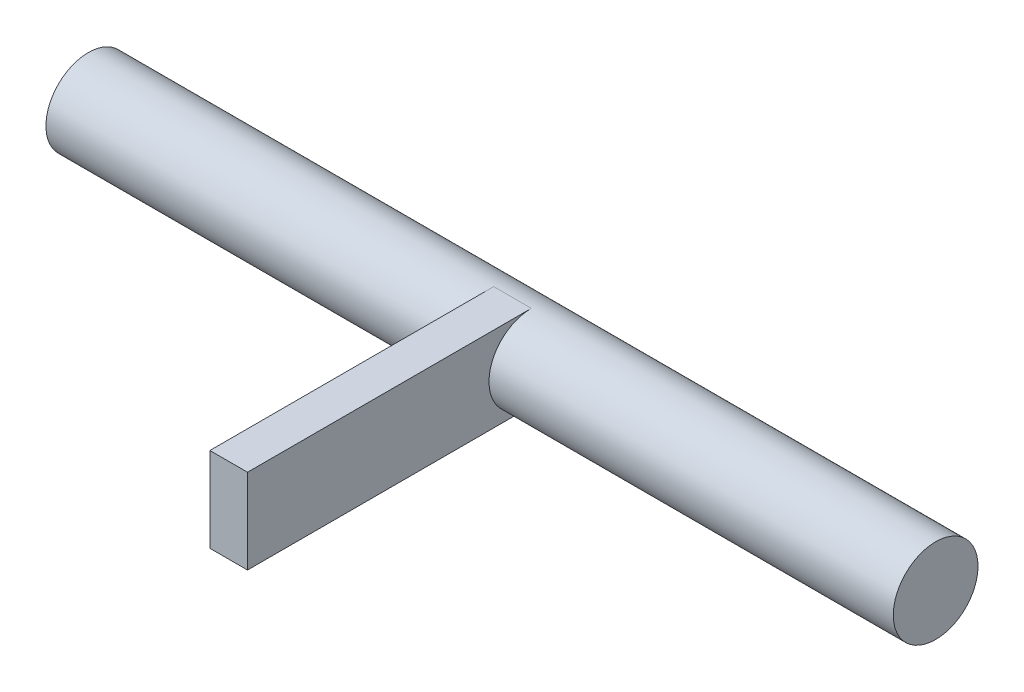
ISO-10303-21;
HEADER;
FILE_DESCRIPTION(('STEP AP214'),'2;1');
FILE_NAME('part.step','',(''),(''),'','','');
FILE_SCHEMA(('AUTOMOTIVE_DESIGN { 1 0 10303 214 1 1 1 1 }'));
ENDSEC;
DATA;
#1=APPLICATION_CONTEXT('core data for automotive mechanical design processes');
#2=APPLICATION_PROTOCOL_DEFINITION('international standard','automotive_design',2000,#1);
#3=PRODUCT_CONTEXT('',#1,'mechanical');
#4=PRODUCT('Part','Part','',(#3));
#5=PRODUCT_RELATED_PRODUCT_CATEGORY('part','',(#4));
#6=PRODUCT_DEFINITION_FORMATION('','',#4);
#7=PRODUCT_DEFINITION_CONTEXT('part definition',#1,'design');
#8=PRODUCT_DEFINITION('design','',#6,#7);
#9=PRODUCT_DEFINITION_SHAPE('','',#8);
#10=(LENGTH_UNIT() NAMED_UNIT(*) SI_UNIT(.MILLI.,.METRE.));
#11=(NAMED_UNIT(*) PLANE_ANGLE_UNIT() SI_UNIT($,.RADIAN.));
#12=(NAMED_UNIT(*) SI_UNIT($,.STERADIAN.) SOLID_ANGLE_UNIT());
#13=UNCERTAINTY_MEASURE_WITH_UNIT(LENGTH_MEASURE(1.E-05),#10,'distance_accuracy_value','');
#14=(GEOMETRIC_REPRESENTATION_CONTEXT(3) GLOBAL_UNCERTAINTY_ASSIGNED_CONTEXT((#13)) GLOBAL_UNIT_ASSIGNED_CONTEXT((#10,
#11,#12)) REPRESENTATION_CONTEXT('',''));
#15=CARTESIAN_POINT('',(0.,0.,0.));
#16=DIRECTION('',(0.,0.,1.));
#17=DIRECTION('',(1.,0.,0.));
#18=AXIS2_PLACEMENT_3D('',#15,#16,#17);
#19=CARTESIAN_POINT('',(200.,0.,0.));
#20=DIRECTION('',(-1.,0.,0.));
#21=DIRECTION('',(0.,0.,1.));
#22=AXIS2_PLACEMENT_3D('',#19,#20,#21);
#23=CYLINDRICAL_SURFACE('',#22,10.);
#24=CARTESIAN_POINT('',(0.,0.,0.));
#25=DIRECTION('',(1.,0.,0.));
#26=DIRECTION('',(0.,0.,-1.));
#27=AXIS2_PLACEMENT_3D('',#24,#25,#26);
#28=CIRCLE('',#27,10.);
#29=CARTESIAN_POINT('',(0.,0.,-10.));
#30=VERTEX_POINT('',#29);
#31=EDGE_CURVE('E97',#30,#30,#28,.T.);
#32=ORIENTED_EDGE('',*,*,#31,.T.);
#33=EDGE_LOOP('',(#32));
#34=FACE_BOUND('',#33,.T.);
#35=CARTESIAN_POINT('',(200.,0.,0.));
#36=DIRECTION('',(1.,0.,0.));
#37=DIRECTION('',(0.,0.,-1.));
#38=AXIS2_PLACEMENT_3D('',#35,#36,#37);
#39=CIRCLE('',#38,10.);
#40=CARTESIAN_POINT('',(200.,0.,-10.));
#41=VERTEX_POINT('',#40);
#42=EDGE_CURVE('E100',#41,#41,#39,.T.);
#43=ORIENTED_EDGE('',*,*,#42,.F.);
#44=EDGE_LOOP('',(#43));
#45=FACE_BOUND('',#44,.T.);
#46=CARTESIAN_POINT('',(104.582118577058,0.,0.));
#47=DIRECTION('',(-1.,0.,0.));
#48=DIRECTION('',(0.,0.,1.));
#49=AXIS2_PLACEMENT_3D('',#46,#47,#48);
#50=CIRCLE('',#49,10.);
#51=CARTESIAN_POINT('',(104.582118577058,-10.,0.));
#52=VERTEX_POINT('',#51);
#53=CARTESIAN_POINT('',(104.582118577058,10.,0.));
#54=VERTEX_POINT('',#53);
#55=EDGE_CURVE('E11',#52,#54,#50,.T.);
#56=ORIENTED_EDGE('',*,*,#55,.F.);
#57=DIRECTION('',(1.,0.,0.));
#58=VECTOR('',#57,1.);
#59=CARTESIAN_POINT('',(95.6955855791269,-10.,0.));
#60=LINE('',#59,#58);
#61=CARTESIAN_POINT('',(95.6955855791269,-10.,0.));
#62=VERTEX_POINT('',#61);
#63=EDGE_CURVE('E94',#62,#52,#60,.T.);
#64=ORIENTED_EDGE('',*,*,#63,.F.);
#65=CARTESIAN_POINT('',(95.6955855791269,0.,0.));
#66=DIRECTION('',(1.,0.,0.));
#67=DIRECTION('',(0.,0.,-1.));
#68=AXIS2_PLACEMENT_3D('',#65,#66,#67);
#69=CIRCLE('',#68,10.);
#70=CARTESIAN_POINT('',(95.6955855791269,10.,0.));
#71=VERTEX_POINT('',#70);
#72=EDGE_CURVE('E46',#71,#62,#69,.T.);
#73=ORIENTED_EDGE('',*,*,#72,.F.);
#74=DIRECTION('',(-1.,0.,0.));
#75=VECTOR('',#74,1.);
#76=CARTESIAN_POINT('',(95.6955855791269,10.,0.));
#77=LINE('',#76,#75);
#78=EDGE_CURVE('E53',#54,#71,#77,.T.);
#79=ORIENTED_EDGE('',*,*,#78,.F.);
#80=EDGE_LOOP('',(#56,#64,#73,#79));
#81=FACE_BOUND('',#80,.T.);
#82=ADVANCED_FACE('F39',(#34,#45,#81),#23,.T.);
#83=CARTESIAN_POINT('',(200.,0.,0.));
#84=DIRECTION('',(1.,0.,0.));
#85=DIRECTION('',(0.,0.,-1.));
#86=AXIS2_PLACEMENT_3D('',#83,#84,#85);
#87=PLANE('',#86);
#88=ORIENTED_EDGE('',*,*,#42,.T.);
#89=EDGE_LOOP('',(#88));
#90=FACE_BOUND('',#89,.T.);
#91=ADVANCED_FACE('F121',(#90),#87,.T.);
#92=CARTESIAN_POINT('',(0.,0.,0.));
#93=DIRECTION('',(1.,0.,0.));
#94=DIRECTION('',(0.,0.,-1.));
#95=AXIS2_PLACEMENT_3D('',#92,#93,#94);
#96=PLANE('',#95);
#97=ORIENTED_EDGE('',*,*,#31,.F.);
#98=EDGE_LOOP('',(#97));
#99=FACE_BOUND('',#98,.T.);
#100=ADVANCED_FACE('F128',(#99),#96,.F.);
#101=CARTESIAN_POINT('',(104.582118577058,10.,66.9999999999999));
#102=DIRECTION('',(-1.,0.,0.));
#103=DIRECTION('',(0.,0.,1.));
#104=AXIS2_PLACEMENT_3D('',#101,#102,#103);
#105=PLANE('',#104);
#106=DIRECTION('',(0.,0.,-1.));
#107=VECTOR('',#106,1.);
#108=CARTESIAN_POINT('',(104.582118577058,-10.,66.9999999999999));
#109=LINE('',#108,#107);
#110=CARTESIAN_POINT('',(104.582118577058,-10.,66.9999999999999));
#111=VERTEX_POINT('',#110);
#112=EDGE_CURVE('E114',#111,#52,#109,.T.);
#113=ORIENTED_EDGE('',*,*,#112,.T.);
#114=ORIENTED_EDGE('',*,*,#55,.T.);
#115=DIRECTION('',(0.,0.,-1.));
#116=VECTOR('',#115,1.);
#117=CARTESIAN_POINT('',(104.582118577058,10.,66.9999999999999));
#118=LINE('',#117,#116);
#119=CARTESIAN_POINT('',(104.582118577058,10.,66.9999999999999));
#120=VERTEX_POINT('',#119);
#121=EDGE_CURVE('E79',#120,#54,#118,.T.);
#122=ORIENTED_EDGE('',*,*,#121,.F.);
#123=DIRECTION('',(0.,1.,0.));
#124=VECTOR('',#123,1.);
#125=CARTESIAN_POINT('',(104.582118577058,10.,66.9999999999999));
#126=LINE('',#125,#124);
#127=EDGE_CURVE('E85',#111,#120,#126,.T.);
#128=ORIENTED_EDGE('',*,*,#127,.F.);
#129=EDGE_LOOP('',(#113,#114,#122,#128));
#130=FACE_BOUND('',#129,.T.);
#131=ADVANCED_FACE('F96',(#130),#105,.F.);
#132=CARTESIAN_POINT('',(95.6955855791269,10.,66.9999999999999));
#133=DIRECTION('',(0.,-1.,0.));
#134=DIRECTION('',(0.,0.,-1.));
#135=AXIS2_PLACEMENT_3D('',#132,#133,#134);
#136=PLANE('',#135);
#137=ORIENTED_EDGE('',*,*,#78,.T.);
#138=DIRECTION('',(0.,0.,-1.));
#139=VECTOR('',#138,1.);
#140=CARTESIAN_POINT('',(95.6955855791269,10.,66.9999999999999));
#141=LINE('',#140,#139);
#142=CARTESIAN_POINT('',(95.6955855791269,10.,66.9999999999999));
#143=VERTEX_POINT('',#142);
#144=EDGE_CURVE('E81',#143,#71,#141,.T.);
#145=ORIENTED_EDGE('',*,*,#144,.F.);
#146=DIRECTION('',(-1.,0.,0.));
#147=VECTOR('',#146,1.);
#148=CARTESIAN_POINT('',(95.6955855791269,10.,66.9999999999999));
#149=LINE('',#148,#147);
#150=EDGE_CURVE('E75',#120,#143,#149,.T.);
#151=ORIENTED_EDGE('',*,*,#150,.F.);
#152=ORIENTED_EDGE('',*,*,#121,.T.);
#153=EDGE_LOOP('',(#137,#145,#151,#152));
#154=FACE_BOUND('',#153,.T.);
#155=ADVANCED_FACE('F77',(#154),#136,.F.);
#156=CARTESIAN_POINT('',(95.6955855791269,10.,66.9999999999999));
#157=DIRECTION('',(1.,0.,0.));
#158=DIRECTION('',(0.,0.,-1.));
#159=AXIS2_PLACEMENT_3D('',#156,#157,#158);
#160=PLANE('',#159);
#161=ORIENTED_EDGE('',*,*,#144,.T.);
#162=ORIENTED_EDGE('',*,*,#72,.T.);
#163=DIRECTION('',(0.,0.,-1.));
#164=VECTOR('',#163,1.);
#165=CARTESIAN_POINT('',(95.6955855791269,-10.,66.9999999999999));
#166=LINE('',#165,#164);
#167=CARTESIAN_POINT('',(95.6955855791269,-10.,66.9999999999999));
#168=VERTEX_POINT('',#167);
#169=EDGE_CURVE('E102',#168,#62,#166,.T.);
#170=ORIENTED_EDGE('',*,*,#169,.F.);
#171=DIRECTION('',(0.,-1.,0.));
#172=VECTOR('',#171,1.);
#173=CARTESIAN_POINT('',(95.6955855791269,10.,66.9999999999999));
#174=LINE('',#173,#172);
#175=EDGE_CURVE('E84',#143,#168,#174,.T.);
#176=ORIENTED_EDGE('',*,*,#175,.F.);
#177=EDGE_LOOP('',(#161,#162,#170,#176));
#178=FACE_BOUND('',#177,.T.);
#179=ADVANCED_FACE('F110',(#178),#160,.F.);
#180=CARTESIAN_POINT('',(95.6955855791269,-10.,66.9999999999999));
#181=DIRECTION('',(0.,1.,0.));
#182=DIRECTION('',(0.,0.,1.));
#183=AXIS2_PLACEMENT_3D('',#180,#181,#182);
#184=PLANE('',#183);
#185=ORIENTED_EDGE('',*,*,#63,.T.);
#186=ORIENTED_EDGE('',*,*,#112,.F.);
#187=DIRECTION('',(1.,0.,0.));
#188=VECTOR('',#187,1.);
#189=CARTESIAN_POINT('',(95.6955855791269,-10.,66.9999999999999));
#190=LINE('',#189,#188);
#191=EDGE_CURVE('E90',#168,#111,#190,.T.);
#192=ORIENTED_EDGE('',*,*,#191,.F.);
#193=ORIENTED_EDGE('',*,*,#169,.T.);
#194=EDGE_LOOP('',(#185,#186,#192,#193));
#195=FACE_BOUND('',#194,.T.);
#196=ADVANCED_FACE('F113',(#195),#184,.F.);
#197=CARTESIAN_POINT('',(0.,0.,66.9999999999999));
#198=DIRECTION('',(0.,0.,1.));
#199=DIRECTION('',(1.,0.,0.));
#200=AXIS2_PLACEMENT_3D('',#197,#198,#199);
#201=PLANE('',#200);
#202=ORIENTED_EDGE('',*,*,#127,.T.);
#203=ORIENTED_EDGE('',*,*,#150,.T.);
#204=ORIENTED_EDGE('',*,*,#175,.T.);
#205=ORIENTED_EDGE('',*,*,#191,.T.);
#206=EDGE_LOOP('',(#202,#203,#204,#205));
#207=FACE_BOUND('',#206,.T.);
#208=ADVANCED_FACE('F88',(#207),#201,.T.);
#209=CLOSED_SHELL('',(#82,#91,#100,#131,#155,#179,#196,#208));
#210=MANIFOLD_SOLID_BREP('B2',#209);
#211=ADVANCED_BREP_SHAPE_REPRESENTATION('',(#18,#210),#14);
#212=SHAPE_DEFINITION_REPRESENTATION(#9,#211);
ENDSEC;
END-ISO-10303-21;
